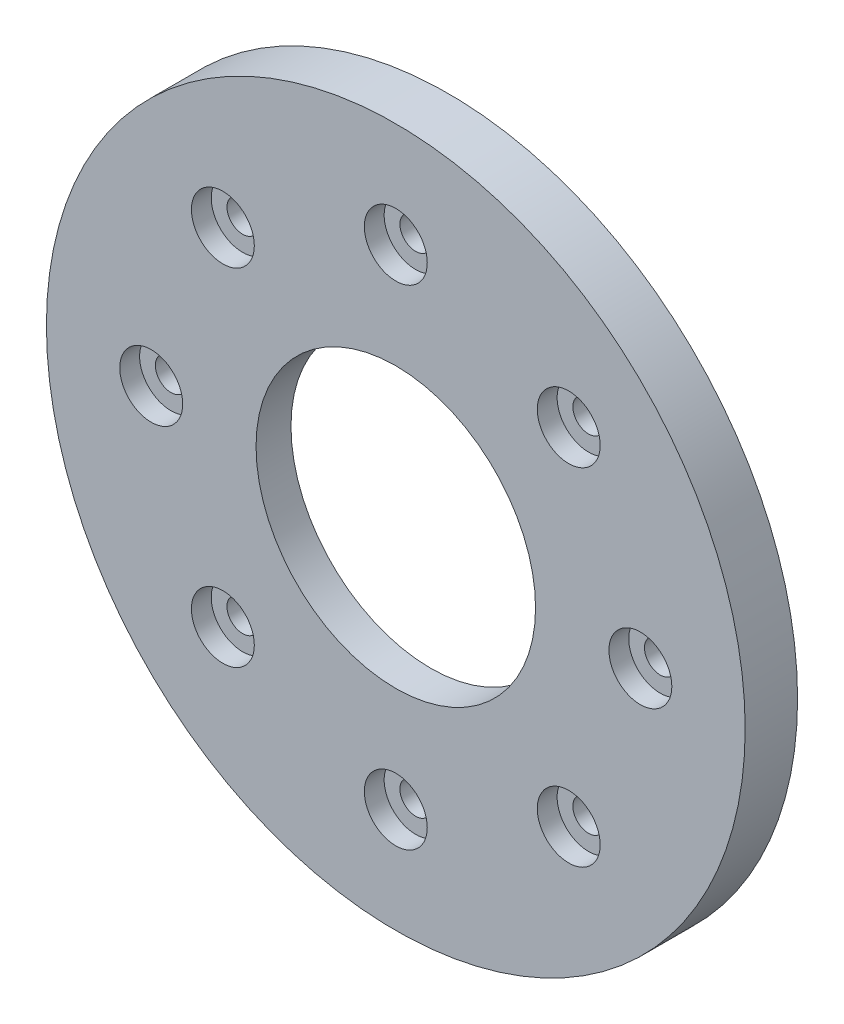
ISO-10303-21;
HEADER;
FILE_DESCRIPTION(('STEP AP214'),'2;1');
FILE_NAME('part.step','',(''),(''),'','','');
FILE_SCHEMA(('AUTOMOTIVE_DESIGN { 1 0 10303 214 1 1 1 1 }'));
ENDSEC;
DATA;
#1=APPLICATION_CONTEXT('core data for automotive mechanical design processes');
#2=APPLICATION_PROTOCOL_DEFINITION('international standard','automotive_design',2000,#1);
#3=PRODUCT_CONTEXT('',#1,'mechanical');
#4=PRODUCT('Part','Part','',(#3));
#5=PRODUCT_RELATED_PRODUCT_CATEGORY('part','',(#4));
#6=PRODUCT_DEFINITION_FORMATION('','',#4);
#7=PRODUCT_DEFINITION_CONTEXT('part definition',#1,'design');
#8=PRODUCT_DEFINITION('design','',#6,#7);
#9=PRODUCT_DEFINITION_SHAPE('','',#8);
#10=(LENGTH_UNIT() NAMED_UNIT(*) SI_UNIT(.MILLI.,.METRE.));
#11=(NAMED_UNIT(*) PLANE_ANGLE_UNIT() SI_UNIT($,.RADIAN.));
#12=(NAMED_UNIT(*) SI_UNIT($,.STERADIAN.) SOLID_ANGLE_UNIT());
#13=UNCERTAINTY_MEASURE_WITH_UNIT(LENGTH_MEASURE(1.E-05),#10,'distance_accuracy_value','');
#14=(GEOMETRIC_REPRESENTATION_CONTEXT(3) GLOBAL_UNCERTAINTY_ASSIGNED_CONTEXT((#13)) GLOBAL_UNIT_ASSIGNED_CONTEXT((#10,
#11,#12)) REPRESENTATION_CONTEXT('',''));
#15=CARTESIAN_POINT('',(0.,0.,0.));
#16=DIRECTION('',(0.,0.,1.));
#17=DIRECTION('',(1.,0.,0.));
#18=AXIS2_PLACEMENT_3D('',#15,#16,#17);
#19=CARTESIAN_POINT('',(0.,0.,15.));
#20=DIRECTION('',(0.,0.,-1.));
#21=DIRECTION('',(-1.,0.,0.));
#22=AXIS2_PLACEMENT_3D('',#19,#20,#21);
#23=CYLINDRICAL_SURFACE('',#22,40.);
#24=CARTESIAN_POINT('',(0.,0.,15.));
#25=DIRECTION('',(0.,0.,1.));
#26=DIRECTION('',(1.,0.,0.));
#27=AXIS2_PLACEMENT_3D('',#24,#25,#26);
#28=CIRCLE('',#27,40.);
#29=CARTESIAN_POINT('',(40.,0.,15.));
#30=VERTEX_POINT('',#29);
#31=EDGE_CURVE('E52',#30,#30,#28,.T.);
#32=ORIENTED_EDGE('',*,*,#31,.T.);
#33=EDGE_LOOP('',(#32));
#34=FACE_BOUND('',#33,.T.);
#35=CARTESIAN_POINT('',(0.,0.,5.));
#36=DIRECTION('',(0.,0.,-1.));
#37=DIRECTION('',(-1.,0.,0.));
#38=AXIS2_PLACEMENT_3D('',#35,#36,#37);
#39=CIRCLE('',#38,40.);
#40=CARTESIAN_POINT('',(-40.,0.,5.));
#41=VERTEX_POINT('',#40);
#42=EDGE_CURVE('E153',#41,#41,#39,.T.);
#43=ORIENTED_EDGE('',*,*,#42,.T.);
#44=EDGE_LOOP('',(#43));
#45=FACE_BOUND('',#44,.T.);
#46=ADVANCED_FACE('F37',(#34,#45),#23,.F.);
#47=CARTESIAN_POINT('',(0.,70.,15.));
#48=DIRECTION('',(0.,0.,1.));
#49=DIRECTION('',(1.,0.,0.));
#50=AXIS2_PLACEMENT_3D('',#47,#48,#49);
#51=CYLINDRICAL_SURFACE('',#50,4.5);
#52=CARTESIAN_POINT('',(0.,70.,9.32));
#53=DIRECTION('',(0.,0.,1.));
#54=DIRECTION('',(1.,0.,0.));
#55=AXIS2_PLACEMENT_3D('',#52,#53,#54);
#56=CIRCLE('',#55,4.5);
#57=CARTESIAN_POINT('',(4.5,70.,9.32));
#58=VERTEX_POINT('',#57);
#59=EDGE_CURVE('E57',#58,#58,#56,.T.);
#60=ORIENTED_EDGE('',*,*,#59,.T.);
#61=EDGE_LOOP('',(#60));
#62=FACE_BOUND('',#61,.T.);
#63=CARTESIAN_POINT('',(0.,70.,5.));
#64=DIRECTION('',(0.,0.,-1.));
#65=DIRECTION('',(-1.,0.,0.));
#66=AXIS2_PLACEMENT_3D('',#63,#64,#65);
#67=CIRCLE('',#66,4.5);
#68=CARTESIAN_POINT('',(-4.5,70.,5.));
#69=VERTEX_POINT('',#68);
#70=EDGE_CURVE('E157',#69,#69,#67,.F.);
#71=ORIENTED_EDGE('',*,*,#70,.F.);
#72=EDGE_LOOP('',(#71));
#73=FACE_BOUND('',#72,.T.);
#74=ADVANCED_FACE('F220',(#62,#73),#51,.F.);
#75=CARTESIAN_POINT('',(-49.4974746830584,49.4974746830583,15.));
#76=DIRECTION('',(0.,0.,1.));
#77=DIRECTION('',(1.,0.,0.));
#78=AXIS2_PLACEMENT_3D('',#75,#76,#77);
#79=CYLINDRICAL_SURFACE('',#78,4.5);
#80=CARTESIAN_POINT('',(-49.4974746830584,49.4974746830583,9.32));
#81=DIRECTION('',(0.,0.,1.));
#82=DIRECTION('',(1.,0.,0.));
#83=AXIS2_PLACEMENT_3D('',#80,#81,#82);
#84=CIRCLE('',#83,4.5);
#85=CARTESIAN_POINT('',(-44.9974746830584,49.4974746830583,9.32));
#86=VERTEX_POINT('',#85);
#87=EDGE_CURVE('E69',#86,#86,#84,.T.);
#88=ORIENTED_EDGE('',*,*,#87,.T.);
#89=EDGE_LOOP('',(#88));
#90=FACE_BOUND('',#89,.T.);
#91=CARTESIAN_POINT('',(-49.4974746830584,49.4974746830583,5.));
#92=DIRECTION('',(0.,0.,-1.));
#93=DIRECTION('',(-1.,0.,0.));
#94=AXIS2_PLACEMENT_3D('',#91,#92,#93);
#95=CIRCLE('',#94,4.5);
#96=CARTESIAN_POINT('',(-53.9974746830584,49.4974746830583,5.));
#97=VERTEX_POINT('',#96);
#98=EDGE_CURVE('E161',#97,#97,#95,.F.);
#99=ORIENTED_EDGE('',*,*,#98,.F.);
#100=EDGE_LOOP('',(#99));
#101=FACE_BOUND('',#100,.T.);
#102=ADVANCED_FACE('F226',(#90,#101),#79,.F.);
#103=CARTESIAN_POINT('',(-70.,-2.44403693719019E-13,15.));
#104=DIRECTION('',(0.,0.,1.));
#105=DIRECTION('',(1.,0.,0.));
#106=AXIS2_PLACEMENT_3D('',#103,#104,#105);
#107=CYLINDRICAL_SURFACE('',#106,4.5);
#108=CARTESIAN_POINT('',(-70.,-2.44403693719019E-13,9.32));
#109=DIRECTION('',(0.,0.,1.));
#110=DIRECTION('',(1.,0.,0.));
#111=AXIS2_PLACEMENT_3D('',#108,#109,#110);
#112=CIRCLE('',#111,4.5);
#113=CARTESIAN_POINT('',(-65.5,-2.44403693719019E-13,9.32));
#114=VERTEX_POINT('',#113);
#115=EDGE_CURVE('E81',#114,#114,#112,.T.);
#116=ORIENTED_EDGE('',*,*,#115,.T.);
#117=EDGE_LOOP('',(#116));
#118=FACE_BOUND('',#117,.T.);
#119=CARTESIAN_POINT('',(-70.,-2.44403693719019E-13,5.));
#120=DIRECTION('',(0.,0.,-1.));
#121=DIRECTION('',(-1.,0.,0.));
#122=AXIS2_PLACEMENT_3D('',#119,#120,#121);
#123=CIRCLE('',#122,4.5);
#124=CARTESIAN_POINT('',(-74.5,-2.44403693719019E-13,5.));
#125=VERTEX_POINT('',#124);
#126=EDGE_CURVE('E165',#125,#125,#123,.F.);
#127=ORIENTED_EDGE('',*,*,#126,.F.);
#128=EDGE_LOOP('',(#127));
#129=FACE_BOUND('',#128,.T.);
#130=ADVANCED_FACE('F303',(#118,#129),#107,.F.);
#131=CARTESIAN_POINT('',(-49.4974746830581,-49.4974746830586,15.));
#132=DIRECTION('',(0.,0.,1.));
#133=DIRECTION('',(1.,0.,0.));
#134=AXIS2_PLACEMENT_3D('',#131,#132,#133);
#135=CYLINDRICAL_SURFACE('',#134,4.5);
#136=CARTESIAN_POINT('',(-49.4974746830581,-49.4974746830586,9.32));
#137=DIRECTION('',(0.,0.,1.));
#138=DIRECTION('',(1.,0.,0.));
#139=AXIS2_PLACEMENT_3D('',#136,#137,#138);
#140=CIRCLE('',#139,4.5);
#141=CARTESIAN_POINT('',(-44.9974746830581,-49.4974746830586,9.32));
#142=VERTEX_POINT('',#141);
#143=EDGE_CURVE('E93',#142,#142,#140,.T.);
#144=ORIENTED_EDGE('',*,*,#143,.T.);
#145=EDGE_LOOP('',(#144));
#146=FACE_BOUND('',#145,.T.);
#147=CARTESIAN_POINT('',(-49.4974746830581,-49.4974746830586,5.));
#148=DIRECTION('',(0.,0.,-1.));
#149=DIRECTION('',(-1.,0.,0.));
#150=AXIS2_PLACEMENT_3D('',#147,#148,#149);
#151=CIRCLE('',#150,4.5);
#152=CARTESIAN_POINT('',(-53.9974746830581,-49.4974746830586,5.));
#153=VERTEX_POINT('',#152);
#154=EDGE_CURVE('E169',#153,#153,#151,.F.);
#155=ORIENTED_EDGE('',*,*,#154,.F.);
#156=EDGE_LOOP('',(#155));
#157=FACE_BOUND('',#156,.T.);
#158=ADVANCED_FACE('F312',(#146,#157),#135,.F.);
#159=CARTESIAN_POINT('',(0.,-70.,15.));
#160=DIRECTION('',(0.,0.,1.));
#161=DIRECTION('',(1.,0.,0.));
#162=AXIS2_PLACEMENT_3D('',#159,#160,#161);
#163=CYLINDRICAL_SURFACE('',#162,4.5);
#164=CARTESIAN_POINT('',(0.,-70.,9.32));
#165=DIRECTION('',(0.,0.,1.));
#166=DIRECTION('',(1.,0.,0.));
#167=AXIS2_PLACEMENT_3D('',#164,#165,#166);
#168=CIRCLE('',#167,4.5);
#169=CARTESIAN_POINT('',(4.5,-70.,9.32));
#170=VERTEX_POINT('',#169);
#171=EDGE_CURVE('E105',#170,#170,#168,.T.);
#172=ORIENTED_EDGE('',*,*,#171,.T.);
#173=EDGE_LOOP('',(#172));
#174=FACE_BOUND('',#173,.T.);
#175=CARTESIAN_POINT('',(0.,-70.,5.));
#176=DIRECTION('',(0.,0.,-1.));
#177=DIRECTION('',(-1.,0.,0.));
#178=AXIS2_PLACEMENT_3D('',#175,#176,#177);
#179=CIRCLE('',#178,4.5);
#180=CARTESIAN_POINT('',(-4.5,-70.,5.));
#181=VERTEX_POINT('',#180);
#182=EDGE_CURVE('E173',#181,#181,#179,.F.);
#183=ORIENTED_EDGE('',*,*,#182,.F.);
#184=EDGE_LOOP('',(#183));
#185=FACE_BOUND('',#184,.T.);
#186=ADVANCED_FACE('F324',(#174,#185),#163,.F.);
#187=CARTESIAN_POINT('',(49.4974746830588,-49.4974746830579,15.));
#188=DIRECTION('',(0.,0.,1.));
#189=DIRECTION('',(1.,0.,0.));
#190=AXIS2_PLACEMENT_3D('',#187,#188,#189);
#191=CYLINDRICAL_SURFACE('',#190,4.5);
#192=CARTESIAN_POINT('',(49.4974746830588,-49.4974746830579,9.32));
#193=DIRECTION('',(0.,0.,1.));
#194=DIRECTION('',(1.,0.,0.));
#195=AXIS2_PLACEMENT_3D('',#192,#193,#194);
#196=CIRCLE('',#195,4.5);
#197=CARTESIAN_POINT('',(53.9974746830588,-49.4974746830579,9.32));
#198=VERTEX_POINT('',#197);
#199=EDGE_CURVE('E117',#198,#198,#196,.T.);
#200=ORIENTED_EDGE('',*,*,#199,.T.);
#201=EDGE_LOOP('',(#200));
#202=FACE_BOUND('',#201,.T.);
#203=CARTESIAN_POINT('',(49.4974746830588,-49.4974746830579,5.));
#204=DIRECTION('',(0.,0.,-1.));
#205=DIRECTION('',(-1.,0.,0.));
#206=AXIS2_PLACEMENT_3D('',#203,#204,#205);
#207=CIRCLE('',#206,4.5);
#208=CARTESIAN_POINT('',(44.9974746830588,-49.4974746830579,5.));
#209=VERTEX_POINT('',#208);
#210=EDGE_CURVE('E177',#209,#209,#207,.F.);
#211=ORIENTED_EDGE('',*,*,#210,.F.);
#212=EDGE_LOOP('',(#211));
#213=FACE_BOUND('',#212,.T.);
#214=ADVANCED_FACE('F214',(#202,#213),#191,.F.);
#215=CARTESIAN_POINT('',(70.,7.33211081157058E-13,15.));
#216=DIRECTION('',(0.,0.,1.));
#217=DIRECTION('',(1.,0.,0.));
#218=AXIS2_PLACEMENT_3D('',#215,#216,#217);
#219=CYLINDRICAL_SURFACE('',#218,4.5);
#220=CARTESIAN_POINT('',(70.,7.33211081157058E-13,9.32));
#221=DIRECTION('',(0.,0.,1.));
#222=DIRECTION('',(1.,0.,0.));
#223=AXIS2_PLACEMENT_3D('',#220,#221,#222);
#224=CIRCLE('',#223,4.5);
#225=CARTESIAN_POINT('',(74.5,7.33211081157058E-13,9.32));
#226=VERTEX_POINT('',#225);
#227=EDGE_CURVE('E129',#226,#226,#224,.T.);
#228=ORIENTED_EDGE('',*,*,#227,.T.);
#229=EDGE_LOOP('',(#228));
#230=FACE_BOUND('',#229,.T.);
#231=CARTESIAN_POINT('',(70.,7.33211081157058E-13,5.));
#232=DIRECTION('',(0.,0.,-1.));
#233=DIRECTION('',(-1.,0.,0.));
#234=AXIS2_PLACEMENT_3D('',#231,#232,#233);
#235=CIRCLE('',#234,4.5);
#236=CARTESIAN_POINT('',(65.5,7.33211081157058E-13,5.));
#237=VERTEX_POINT('',#236);
#238=EDGE_CURVE('E181',#237,#237,#235,.F.);
#239=ORIENTED_EDGE('',*,*,#238,.F.);
#240=EDGE_LOOP('',(#239));
#241=FACE_BOUND('',#240,.T.);
#242=ADVANCED_FACE('F204',(#230,#241),#219,.F.);
#243=CARTESIAN_POINT('',(49.4974746830577,49.4974746830589,15.));
#244=DIRECTION('',(0.,0.,1.));
#245=DIRECTION('',(1.,0.,0.));
#246=AXIS2_PLACEMENT_3D('',#243,#244,#245);
#247=CYLINDRICAL_SURFACE('',#246,4.5);
#248=CARTESIAN_POINT('',(49.4974746830577,49.4974746830589,9.32));
#249=DIRECTION('',(0.,0.,1.));
#250=DIRECTION('',(1.,0.,0.));
#251=AXIS2_PLACEMENT_3D('',#248,#249,#250);
#252=CIRCLE('',#251,4.5);
#253=CARTESIAN_POINT('',(53.9974746830577,49.4974746830589,9.32));
#254=VERTEX_POINT('',#253);
#255=EDGE_CURVE('E141',#254,#254,#252,.T.);
#256=ORIENTED_EDGE('',*,*,#255,.T.);
#257=EDGE_LOOP('',(#256));
#258=FACE_BOUND('',#257,.T.);
#259=CARTESIAN_POINT('',(49.4974746830577,49.4974746830589,5.));
#260=DIRECTION('',(0.,0.,-1.));
#261=DIRECTION('',(-1.,0.,0.));
#262=AXIS2_PLACEMENT_3D('',#259,#260,#261);
#263=CIRCLE('',#262,4.5);
#264=CARTESIAN_POINT('',(44.9974746830577,49.4974746830589,5.));
#265=VERTEX_POINT('',#264);
#266=EDGE_CURVE('E41',#265,#265,#263,.F.);
#267=ORIENTED_EDGE('',*,*,#266,.F.);
#268=EDGE_LOOP('',(#267));
#269=FACE_BOUND('',#268,.T.);
#270=ADVANCED_FACE('F201',(#258,#269),#247,.F.);
#271=CARTESIAN_POINT('',(0.,0.,15.));
#272=DIRECTION('',(0.,0.,1.));
#273=DIRECTION('',(1.,0.,0.));
#274=AXIS2_PLACEMENT_3D('',#271,#272,#273);
#275=PLANE('',#274);
#276=CARTESIAN_POINT('',(49.4974746830577,49.4974746830589,15.));
#277=DIRECTION('',(0.,0.,1.));
#278=DIRECTION('',(1.,0.,0.));
#279=AXIS2_PLACEMENT_3D('',#276,#277,#278);
#280=CIRCLE('',#279,9.005);
#281=CARTESIAN_POINT('',(58.5024746830577,49.4974746830589,15.));
#282=VERTEX_POINT('',#281);
#283=EDGE_CURVE('E149',#282,#282,#280,.T.);
#284=ORIENTED_EDGE('',*,*,#283,.F.);
#285=EDGE_LOOP('',(#284));
#286=FACE_BOUND('',#285,.T.);
#287=CARTESIAN_POINT('',(70.,7.33211081157058E-13,15.));
#288=DIRECTION('',(0.,0.,1.));
#289=DIRECTION('',(1.,0.,0.));
#290=AXIS2_PLACEMENT_3D('',#287,#288,#289);
#291=CIRCLE('',#290,9.005);
#292=CARTESIAN_POINT('',(79.005,7.33211081157058E-13,15.));
#293=VERTEX_POINT('',#292);
#294=EDGE_CURVE('E137',#293,#293,#291,.T.);
#295=ORIENTED_EDGE('',*,*,#294,.F.);
#296=EDGE_LOOP('',(#295));
#297=FACE_BOUND('',#296,.T.);
#298=CARTESIAN_POINT('',(49.4974746830588,-49.4974746830579,15.));
#299=DIRECTION('',(0.,0.,1.));
#300=DIRECTION('',(1.,0.,0.));
#301=AXIS2_PLACEMENT_3D('',#298,#299,#300);
#302=CIRCLE('',#301,9.005);
#303=CARTESIAN_POINT('',(58.5024746830588,-49.4974746830579,15.));
#304=VERTEX_POINT('',#303);
#305=EDGE_CURVE('E125',#304,#304,#302,.T.);
#306=ORIENTED_EDGE('',*,*,#305,.F.);
#307=EDGE_LOOP('',(#306));
#308=FACE_BOUND('',#307,.T.);
#309=CARTESIAN_POINT('',(0.,-70.,15.));
#310=DIRECTION('',(0.,0.,1.));
#311=DIRECTION('',(1.,0.,0.));
#312=AXIS2_PLACEMENT_3D('',#309,#310,#311);
#313=CIRCLE('',#312,9.005);
#314=CARTESIAN_POINT('',(9.005,-70.,15.));
#315=VERTEX_POINT('',#314);
#316=EDGE_CURVE('E113',#315,#315,#313,.T.);
#317=ORIENTED_EDGE('',*,*,#316,.F.);
#318=EDGE_LOOP('',(#317));
#319=FACE_BOUND('',#318,.T.);
#320=CARTESIAN_POINT('',(-49.4974746830581,-49.4974746830586,15.));
#321=DIRECTION('',(0.,0.,1.));
#322=DIRECTION('',(1.,0.,0.));
#323=AXIS2_PLACEMENT_3D('',#320,#321,#322);
#324=CIRCLE('',#323,9.005);
#325=CARTESIAN_POINT('',(-40.4924746830581,-49.4974746830586,15.));
#326=VERTEX_POINT('',#325);
#327=EDGE_CURVE('E101',#326,#326,#324,.T.);
#328=ORIENTED_EDGE('',*,*,#327,.F.);
#329=EDGE_LOOP('',(#328));
#330=FACE_BOUND('',#329,.T.);
#331=CARTESIAN_POINT('',(-70.,-2.44403693719019E-13,15.));
#332=DIRECTION('',(0.,0.,1.));
#333=DIRECTION('',(1.,0.,0.));
#334=AXIS2_PLACEMENT_3D('',#331,#332,#333);
#335=CIRCLE('',#334,9.005);
#336=CARTESIAN_POINT('',(-60.995,-2.44403693719019E-13,15.));
#337=VERTEX_POINT('',#336);
#338=EDGE_CURVE('E89',#337,#337,#335,.T.);
#339=ORIENTED_EDGE('',*,*,#338,.F.);
#340=EDGE_LOOP('',(#339));
#341=FACE_BOUND('',#340,.T.);
#342=CARTESIAN_POINT('',(-49.4974746830584,49.4974746830583,15.));
#343=DIRECTION('',(0.,0.,1.));
#344=DIRECTION('',(1.,0.,0.));
#345=AXIS2_PLACEMENT_3D('',#342,#343,#344);
#346=CIRCLE('',#345,9.005);
#347=CARTESIAN_POINT('',(-40.4924746830584,49.4974746830583,15.));
#348=VERTEX_POINT('',#347);
#349=EDGE_CURVE('E77',#348,#348,#346,.T.);
#350=ORIENTED_EDGE('',*,*,#349,.F.);
#351=EDGE_LOOP('',(#350));
#352=FACE_BOUND('',#351,.T.);
#353=CARTESIAN_POINT('',(0.,70.,15.));
#354=DIRECTION('',(0.,0.,1.));
#355=DIRECTION('',(1.,0.,0.));
#356=AXIS2_PLACEMENT_3D('',#353,#354,#355);
#357=CIRCLE('',#356,9.005);
#358=CARTESIAN_POINT('',(9.005,70.,15.));
#359=VERTEX_POINT('',#358);
#360=EDGE_CURVE('E65',#359,#359,#357,.T.);
#361=ORIENTED_EDGE('',*,*,#360,.F.);
#362=EDGE_LOOP('',(#361));
#363=FACE_BOUND('',#362,.T.);
#364=CARTESIAN_POINT('',(0.,0.,15.));
#365=DIRECTION('',(0.,0.,1.));
#366=DIRECTION('',(1.,0.,0.));
#367=AXIS2_PLACEMENT_3D('',#364,#365,#366);
#368=CIRCLE('',#367,100.);
#369=CARTESIAN_POINT('',(100.,0.,15.));
#370=VERTEX_POINT('',#369);
#371=EDGE_CURVE('E10',#370,#370,#368,.T.);
#372=ORIENTED_EDGE('',*,*,#371,.T.);
#373=EDGE_LOOP('',(#372));
#374=FACE_BOUND('',#373,.T.);
#375=ORIENTED_EDGE('',*,*,#31,.F.);
#376=EDGE_LOOP('',(#375));
#377=FACE_BOUND('',#376,.T.);
#378=ADVANCED_FACE('F203',(#286,#297,#308,#319,#330,#341,#352,#363,#374,#377),#275,.T.);
#379=CARTESIAN_POINT('',(0.,0.,0.));
#380=DIRECTION('',(0.,0.,1.));
#381=DIRECTION('',(1.,0.,0.));
#382=AXIS2_PLACEMENT_3D('',#379,#380,#381);
#383=PLANE('',#382);
#384=CARTESIAN_POINT('',(0.,0.,0.));
#385=DIRECTION('',(0.,0.,-1.));
#386=DIRECTION('',(-1.,0.,0.));
#387=AXIS2_PLACEMENT_3D('',#384,#385,#386);
#388=CIRCLE('',#387,82.5);
#389=CARTESIAN_POINT('',(-82.5,0.,0.));
#390=VERTEX_POINT('',#389);
#391=EDGE_CURVE('E185',#390,#390,#388,.T.);
#392=ORIENTED_EDGE('',*,*,#391,.F.);
#393=EDGE_LOOP('',(#392));
#394=FACE_BOUND('',#393,.T.);
#395=CARTESIAN_POINT('',(0.,0.,0.));
#396=DIRECTION('',(0.,0.,1.));
#397=DIRECTION('',(1.,0.,0.));
#398=AXIS2_PLACEMENT_3D('',#395,#396,#397);
#399=CIRCLE('',#398,100.);
#400=CARTESIAN_POINT('',(100.,0.,0.));
#401=VERTEX_POINT('',#400);
#402=EDGE_CURVE('E46',#401,#401,#399,.T.);
#403=ORIENTED_EDGE('',*,*,#402,.F.);
#404=EDGE_LOOP('',(#403));
#405=FACE_BOUND('',#404,.T.);
#406=ADVANCED_FACE('F211',(#394,#405),#383,.F.);
#407=CARTESIAN_POINT('',(0.,0.,15.));
#408=DIRECTION('',(0.,0.,-1.));
#409=DIRECTION('',(-1.,0.,0.));
#410=AXIS2_PLACEMENT_3D('',#407,#408,#409);
#411=CYLINDRICAL_SURFACE('',#410,100.);
#412=ORIENTED_EDGE('',*,*,#371,.F.);
#413=EDGE_LOOP('',(#412));
#414=FACE_BOUND('',#413,.T.);
#415=ORIENTED_EDGE('',*,*,#402,.T.);
#416=EDGE_LOOP('',(#415));
#417=FACE_BOUND('',#416,.T.);
#418=ADVANCED_FACE('F39',(#414,#417),#411,.T.);
#419=CARTESIAN_POINT('',(4.5,70.,9.32));
#420=DIRECTION('',(0.,0.,-1.));
#421=DIRECTION('',(-1.,0.,0.));
#422=AXIS2_PLACEMENT_3D('',#419,#420,#421);
#423=PLANE('',#422);
#424=ORIENTED_EDGE('',*,*,#59,.F.);
#425=EDGE_LOOP('',(#424));
#426=FACE_BOUND('',#425,.T.);
#427=CARTESIAN_POINT('',(0.,70.,9.32));
#428=DIRECTION('',(0.,0.,1.));
#429=DIRECTION('',(1.,0.,0.));
#430=AXIS2_PLACEMENT_3D('',#427,#428,#429);
#431=CIRCLE('',#430,9.005);
#432=CARTESIAN_POINT('',(9.005,70.,9.32));
#433=VERTEX_POINT('',#432);
#434=EDGE_CURVE('E61',#433,#433,#431,.T.);
#435=ORIENTED_EDGE('',*,*,#434,.T.);
#436=EDGE_LOOP('',(#435));
#437=FACE_BOUND('',#436,.T.);
#438=ADVANCED_FACE('F236',(#426,#437),#423,.F.);
#439=CARTESIAN_POINT('',(0.,70.,15.));
#440=DIRECTION('',(0.,0.,1.));
#441=DIRECTION('',(1.,0.,0.));
#442=AXIS2_PLACEMENT_3D('',#439,#440,#441);
#443=CYLINDRICAL_SURFACE('',#442,9.005);
#444=ORIENTED_EDGE('',*,*,#434,.F.);
#445=EDGE_LOOP('',(#444));
#446=FACE_BOUND('',#445,.T.);
#447=ORIENTED_EDGE('',*,*,#360,.T.);
#448=EDGE_LOOP('',(#447));
#449=FACE_BOUND('',#448,.T.);
#450=ADVANCED_FACE('F287',(#446,#449),#443,.F.);
#451=CARTESIAN_POINT('',(-44.9974746830584,49.4974746830583,9.32));
#452=DIRECTION('',(0.,0.,-1.));
#453=DIRECTION('',(-1.,0.,0.));
#454=AXIS2_PLACEMENT_3D('',#451,#452,#453);
#455=PLANE('',#454);
#456=ORIENTED_EDGE('',*,*,#87,.F.);
#457=EDGE_LOOP('',(#456));
#458=FACE_BOUND('',#457,.T.);
#459=CARTESIAN_POINT('',(-49.4974746830584,49.4974746830583,9.32));
#460=DIRECTION('',(0.,0.,1.));
#461=DIRECTION('',(1.,0.,0.));
#462=AXIS2_PLACEMENT_3D('',#459,#460,#461);
#463=CIRCLE('',#462,9.005);
#464=CARTESIAN_POINT('',(-40.4924746830584,49.4974746830583,9.32));
#465=VERTEX_POINT('',#464);
#466=EDGE_CURVE('E73',#465,#465,#463,.T.);
#467=ORIENTED_EDGE('',*,*,#466,.T.);
#468=EDGE_LOOP('',(#467));
#469=FACE_BOUND('',#468,.T.);
#470=ADVANCED_FACE('F289',(#458,#469),#455,.F.);
#471=CARTESIAN_POINT('',(-49.4974746830584,49.4974746830583,15.));
#472=DIRECTION('',(0.,0.,1.));
#473=DIRECTION('',(1.,0.,0.));
#474=AXIS2_PLACEMENT_3D('',#471,#472,#473);
#475=CYLINDRICAL_SURFACE('',#474,9.005);
#476=ORIENTED_EDGE('',*,*,#466,.F.);
#477=EDGE_LOOP('',(#476));
#478=FACE_BOUND('',#477,.T.);
#479=ORIENTED_EDGE('',*,*,#349,.T.);
#480=EDGE_LOOP('',(#479));
#481=FACE_BOUND('',#480,.T.);
#482=ADVANCED_FACE('F296',(#478,#481),#475,.F.);
#483=CARTESIAN_POINT('',(-65.5,-2.44403693719019E-13,9.32));
#484=DIRECTION('',(0.,0.,-1.));
#485=DIRECTION('',(-1.,0.,0.));
#486=AXIS2_PLACEMENT_3D('',#483,#484,#485);
#487=PLANE('',#486);
#488=ORIENTED_EDGE('',*,*,#115,.F.);
#489=EDGE_LOOP('',(#488));
#490=FACE_BOUND('',#489,.T.);
#491=CARTESIAN_POINT('',(-70.,-2.44403693719019E-13,9.32));
#492=DIRECTION('',(0.,0.,1.));
#493=DIRECTION('',(1.,0.,0.));
#494=AXIS2_PLACEMENT_3D('',#491,#492,#493);
#495=CIRCLE('',#494,9.005);
#496=CARTESIAN_POINT('',(-60.995,-2.44403693719019E-13,9.32));
#497=VERTEX_POINT('',#496);
#498=EDGE_CURVE('E85',#497,#497,#495,.T.);
#499=ORIENTED_EDGE('',*,*,#498,.T.);
#500=EDGE_LOOP('',(#499));
#501=FACE_BOUND('',#500,.T.);
#502=ADVANCED_FACE('F308',(#490,#501),#487,.F.);
#503=CARTESIAN_POINT('',(-70.,-2.44403693719019E-13,15.));
#504=DIRECTION('',(0.,0.,1.));
#505=DIRECTION('',(1.,0.,0.));
#506=AXIS2_PLACEMENT_3D('',#503,#504,#505);
#507=CYLINDRICAL_SURFACE('',#506,9.005);
#508=ORIENTED_EDGE('',*,*,#498,.F.);
#509=EDGE_LOOP('',(#508));
#510=FACE_BOUND('',#509,.T.);
#511=ORIENTED_EDGE('',*,*,#338,.T.);
#512=EDGE_LOOP('',(#511));
#513=FACE_BOUND('',#512,.T.);
#514=ADVANCED_FACE('F316',(#510,#513),#507,.F.);
#515=CARTESIAN_POINT('',(-44.9974746830581,-49.4974746830586,9.32));
#516=DIRECTION('',(0.,0.,-1.));
#517=DIRECTION('',(-1.,0.,0.));
#518=AXIS2_PLACEMENT_3D('',#515,#516,#517);
#519=PLANE('',#518);
#520=ORIENTED_EDGE('',*,*,#143,.F.);
#521=EDGE_LOOP('',(#520));
#522=FACE_BOUND('',#521,.T.);
#523=CARTESIAN_POINT('',(-49.4974746830581,-49.4974746830586,9.32));
#524=DIRECTION('',(0.,0.,1.));
#525=DIRECTION('',(1.,0.,0.));
#526=AXIS2_PLACEMENT_3D('',#523,#524,#525);
#527=CIRCLE('',#526,9.005);
#528=CARTESIAN_POINT('',(-40.4924746830581,-49.4974746830586,9.32));
#529=VERTEX_POINT('',#528);
#530=EDGE_CURVE('E97',#529,#529,#527,.T.);
#531=ORIENTED_EDGE('',*,*,#530,.T.);
#532=EDGE_LOOP('',(#531));
#533=FACE_BOUND('',#532,.T.);
#534=ADVANCED_FACE('F320',(#522,#533),#519,.F.);
#535=CARTESIAN_POINT('',(-49.4974746830581,-49.4974746830586,15.));
#536=DIRECTION('',(0.,0.,1.));
#537=DIRECTION('',(1.,0.,0.));
#538=AXIS2_PLACEMENT_3D('',#535,#536,#537);
#539=CYLINDRICAL_SURFACE('',#538,9.005);
#540=ORIENTED_EDGE('',*,*,#530,.F.);
#541=EDGE_LOOP('',(#540));
#542=FACE_BOUND('',#541,.T.);
#543=ORIENTED_EDGE('',*,*,#327,.T.);
#544=EDGE_LOOP('',(#543));
#545=FACE_BOUND('',#544,.T.);
#546=ADVANCED_FACE('F328',(#542,#545),#539,.F.);
#547=CARTESIAN_POINT('',(4.5,-70.,9.32));
#548=DIRECTION('',(0.,0.,-1.));
#549=DIRECTION('',(-1.,0.,0.));
#550=AXIS2_PLACEMENT_3D('',#547,#548,#549);
#551=PLANE('',#550);
#552=ORIENTED_EDGE('',*,*,#171,.F.);
#553=EDGE_LOOP('',(#552));
#554=FACE_BOUND('',#553,.T.);
#555=CARTESIAN_POINT('',(0.,-70.,9.32));
#556=DIRECTION('',(0.,0.,1.));
#557=DIRECTION('',(1.,0.,0.));
#558=AXIS2_PLACEMENT_3D('',#555,#556,#557);
#559=CIRCLE('',#558,9.005);
#560=CARTESIAN_POINT('',(9.005,-70.,9.32));
#561=VERTEX_POINT('',#560);
#562=EDGE_CURVE('E109',#561,#561,#559,.T.);
#563=ORIENTED_EDGE('',*,*,#562,.T.);
#564=EDGE_LOOP('',(#563));
#565=FACE_BOUND('',#564,.T.);
#566=ADVANCED_FACE('F332',(#554,#565),#551,.F.);
#567=CARTESIAN_POINT('',(0.,-70.,15.));
#568=DIRECTION('',(0.,0.,1.));
#569=DIRECTION('',(1.,0.,0.));
#570=AXIS2_PLACEMENT_3D('',#567,#568,#569);
#571=CYLINDRICAL_SURFACE('',#570,9.005);
#572=ORIENTED_EDGE('',*,*,#562,.F.);
#573=EDGE_LOOP('',(#572));
#574=FACE_BOUND('',#573,.T.);
#575=ORIENTED_EDGE('',*,*,#316,.T.);
#576=EDGE_LOOP('',(#575));
#577=FACE_BOUND('',#576,.T.);
#578=ADVANCED_FACE('F339',(#574,#577),#571,.F.);
#579=CARTESIAN_POINT('',(53.9974746830588,-49.4974746830579,9.32));
#580=DIRECTION('',(0.,0.,-1.));
#581=DIRECTION('',(-1.,0.,0.));
#582=AXIS2_PLACEMENT_3D('',#579,#580,#581);
#583=PLANE('',#582);
#584=ORIENTED_EDGE('',*,*,#199,.F.);
#585=EDGE_LOOP('',(#584));
#586=FACE_BOUND('',#585,.T.);
#587=CARTESIAN_POINT('',(49.4974746830588,-49.4974746830579,9.32));
#588=DIRECTION('',(0.,0.,1.));
#589=DIRECTION('',(1.,0.,0.));
#590=AXIS2_PLACEMENT_3D('',#587,#588,#589);
#591=CIRCLE('',#590,9.005);
#592=CARTESIAN_POINT('',(58.5024746830588,-49.4974746830579,9.32));
#593=VERTEX_POINT('',#592);
#594=EDGE_CURVE('E121',#593,#593,#591,.T.);
#595=ORIENTED_EDGE('',*,*,#594,.T.);
#596=EDGE_LOOP('',(#595));
#597=FACE_BOUND('',#596,.T.);
#598=ADVANCED_FACE('F343',(#586,#597),#583,.F.);
#599=CARTESIAN_POINT('',(49.4974746830588,-49.4974746830579,15.));
#600=DIRECTION('',(0.,0.,1.));
#601=DIRECTION('',(1.,0.,0.));
#602=AXIS2_PLACEMENT_3D('',#599,#600,#601);
#603=CYLINDRICAL_SURFACE('',#602,9.005);
#604=ORIENTED_EDGE('',*,*,#594,.F.);
#605=EDGE_LOOP('',(#604));
#606=FACE_BOUND('',#605,.T.);
#607=ORIENTED_EDGE('',*,*,#305,.T.);
#608=EDGE_LOOP('',(#607));
#609=FACE_BOUND('',#608,.T.);
#610=ADVANCED_FACE('F350',(#606,#609),#603,.F.);
#611=CARTESIAN_POINT('',(74.5,7.33211081157058E-13,9.32));
#612=DIRECTION('',(0.,0.,-1.));
#613=DIRECTION('',(-1.,0.,0.));
#614=AXIS2_PLACEMENT_3D('',#611,#612,#613);
#615=PLANE('',#614);
#616=ORIENTED_EDGE('',*,*,#227,.F.);
#617=EDGE_LOOP('',(#616));
#618=FACE_BOUND('',#617,.T.);
#619=CARTESIAN_POINT('',(70.,7.33211081157058E-13,9.32));
#620=DIRECTION('',(0.,0.,1.));
#621=DIRECTION('',(1.,0.,0.));
#622=AXIS2_PLACEMENT_3D('',#619,#620,#621);
#623=CIRCLE('',#622,9.005);
#624=CARTESIAN_POINT('',(79.005,7.33211081157058E-13,9.32));
#625=VERTEX_POINT('',#624);
#626=EDGE_CURVE('E133',#625,#625,#623,.T.);
#627=ORIENTED_EDGE('',*,*,#626,.T.);
#628=EDGE_LOOP('',(#627));
#629=FACE_BOUND('',#628,.T.);
#630=ADVANCED_FACE('F263',(#618,#629),#615,.F.);
#631=CARTESIAN_POINT('',(70.,7.33211081157058E-13,15.));
#632=DIRECTION('',(0.,0.,1.));
#633=DIRECTION('',(1.,0.,0.));
#634=AXIS2_PLACEMENT_3D('',#631,#632,#633);
#635=CYLINDRICAL_SURFACE('',#634,9.005);
#636=ORIENTED_EDGE('',*,*,#626,.F.);
#637=EDGE_LOOP('',(#636));
#638=FACE_BOUND('',#637,.T.);
#639=ORIENTED_EDGE('',*,*,#294,.T.);
#640=EDGE_LOOP('',(#639));
#641=FACE_BOUND('',#640,.T.);
#642=ADVANCED_FACE('F258',(#638,#641),#635,.F.);
#643=CARTESIAN_POINT('',(53.9974746830577,49.4974746830589,9.32));
#644=DIRECTION('',(0.,0.,-1.));
#645=DIRECTION('',(-1.,0.,0.));
#646=AXIS2_PLACEMENT_3D('',#643,#644,#645);
#647=PLANE('',#646);
#648=ORIENTED_EDGE('',*,*,#255,.F.);
#649=EDGE_LOOP('',(#648));
#650=FACE_BOUND('',#649,.T.);
#651=CARTESIAN_POINT('',(49.4974746830577,49.4974746830589,9.32));
#652=DIRECTION('',(0.,0.,1.));
#653=DIRECTION('',(1.,0.,0.));
#654=AXIS2_PLACEMENT_3D('',#651,#652,#653);
#655=CIRCLE('',#654,9.005);
#656=CARTESIAN_POINT('',(58.5024746830577,49.4974746830589,9.32));
#657=VERTEX_POINT('',#656);
#658=EDGE_CURVE('E145',#657,#657,#655,.T.);
#659=ORIENTED_EDGE('',*,*,#658,.T.);
#660=EDGE_LOOP('',(#659));
#661=FACE_BOUND('',#660,.T.);
#662=ADVANCED_FACE('F255',(#650,#661),#647,.F.);
#663=CARTESIAN_POINT('',(49.4974746830577,49.4974746830589,15.));
#664=DIRECTION('',(0.,0.,1.));
#665=DIRECTION('',(1.,0.,0.));
#666=AXIS2_PLACEMENT_3D('',#663,#664,#665);
#667=CYLINDRICAL_SURFACE('',#666,9.005);
#668=ORIENTED_EDGE('',*,*,#658,.F.);
#669=EDGE_LOOP('',(#668));
#670=FACE_BOUND('',#669,.T.);
#671=ORIENTED_EDGE('',*,*,#283,.T.);
#672=EDGE_LOOP('',(#671));
#673=FACE_BOUND('',#672,.T.);
#674=ADVANCED_FACE('F250',(#670,#673),#667,.F.);
#675=CARTESIAN_POINT('',(0.,0.,5.));
#676=DIRECTION('',(0.,0.,-1.));
#677=DIRECTION('',(-1.,0.,0.));
#678=AXIS2_PLACEMENT_3D('',#675,#676,#677);
#679=PLANE('',#678);
#680=ORIENTED_EDGE('',*,*,#42,.F.);
#681=EDGE_LOOP('',(#680));
#682=FACE_BOUND('',#681,.T.);
#683=CARTESIAN_POINT('',(0.,0.,5.));
#684=DIRECTION('',(0.,0.,-1.));
#685=DIRECTION('',(-1.,0.,0.));
#686=AXIS2_PLACEMENT_3D('',#683,#684,#685);
#687=CIRCLE('',#686,82.5);
#688=CARTESIAN_POINT('',(-82.5,0.,5.));
#689=VERTEX_POINT('',#688);
#690=EDGE_CURVE('E189',#689,#689,#687,.T.);
#691=ORIENTED_EDGE('',*,*,#690,.T.);
#692=EDGE_LOOP('',(#691));
#693=FACE_BOUND('',#692,.T.);
#694=ORIENTED_EDGE('',*,*,#266,.T.);
#695=EDGE_LOOP('',(#694));
#696=FACE_BOUND('',#695,.T.);
#697=ORIENTED_EDGE('',*,*,#238,.T.);
#698=EDGE_LOOP('',(#697));
#699=FACE_BOUND('',#698,.T.);
#700=ORIENTED_EDGE('',*,*,#210,.T.);
#701=EDGE_LOOP('',(#700));
#702=FACE_BOUND('',#701,.T.);
#703=ORIENTED_EDGE('',*,*,#182,.T.);
#704=EDGE_LOOP('',(#703));
#705=FACE_BOUND('',#704,.T.);
#706=ORIENTED_EDGE('',*,*,#154,.T.);
#707=EDGE_LOOP('',(#706));
#708=FACE_BOUND('',#707,.T.);
#709=ORIENTED_EDGE('',*,*,#126,.T.);
#710=EDGE_LOOP('',(#709));
#711=FACE_BOUND('',#710,.T.);
#712=ORIENTED_EDGE('',*,*,#98,.T.);
#713=EDGE_LOOP('',(#712));
#714=FACE_BOUND('',#713,.T.);
#715=ORIENTED_EDGE('',*,*,#70,.T.);
#716=EDGE_LOOP('',(#715));
#717=FACE_BOUND('',#716,.T.);
#718=ADVANCED_FACE('F198',(#682,#693,#696,#699,#702,#705,#708,#711,#714,#717),#679,.T.);
#719=CARTESIAN_POINT('',(0.,0.,5.));
#720=DIRECTION('',(0.,0.,-1.));
#721=DIRECTION('',(-1.,0.,0.));
#722=AXIS2_PLACEMENT_3D('',#719,#720,#721);
#723=CYLINDRICAL_SURFACE('',#722,82.5);
#724=ORIENTED_EDGE('',*,*,#690,.F.);
#725=EDGE_LOOP('',(#724));
#726=FACE_BOUND('',#725,.T.);
#727=ORIENTED_EDGE('',*,*,#391,.T.);
#728=EDGE_LOOP('',(#727));
#729=FACE_BOUND('',#728,.T.);
#730=ADVANCED_FACE('F243',(#726,#729),#723,.F.);
#731=CLOSED_SHELL('',(#46,#74,#102,#130,#158,#186,#214,#242,#270,#378,#406,#418,#438,#450,#470,
#482,#502,#514,#534,#546,#566,#578,#598,#610,#630,#642,#662,#674,#718,#730));
#732=MANIFOLD_SOLID_BREP('B2',#731);
#733=ADVANCED_BREP_SHAPE_REPRESENTATION('',(#18,#732),#14);
#734=SHAPE_DEFINITION_REPRESENTATION(#9,#733);
ENDSEC;
END-ISO-10303-21;
